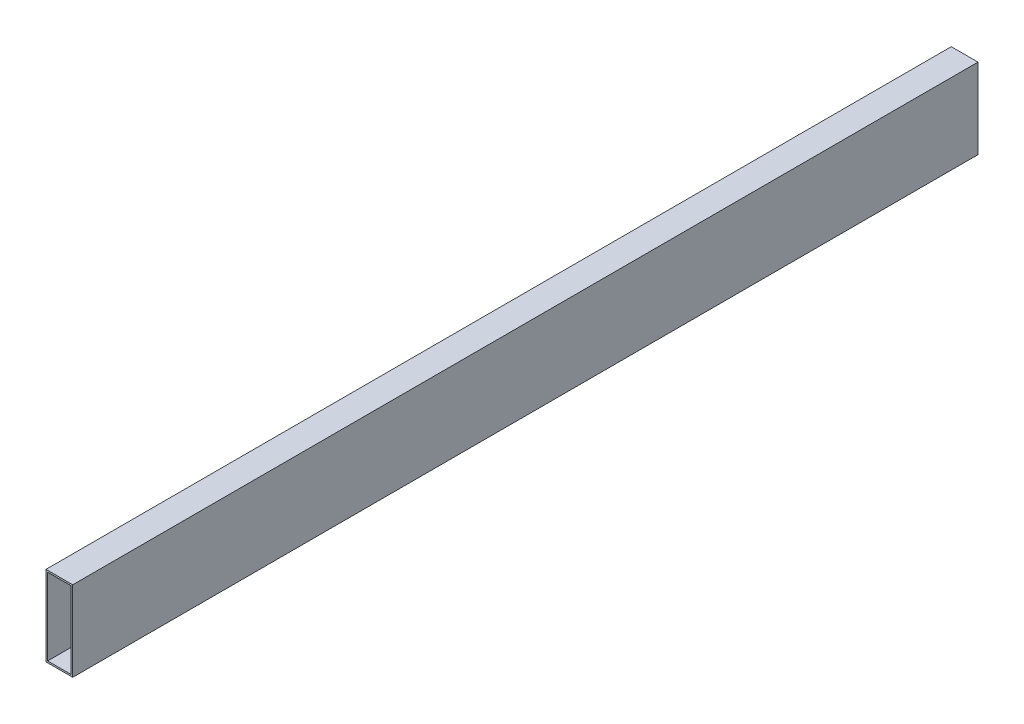
ISO-10303-21;
HEADER;
FILE_DESCRIPTION(('STEP AP214'),'2;1');
FILE_NAME('part.step','',(''),(''),'','','');
FILE_SCHEMA(('AUTOMOTIVE_DESIGN { 1 0 10303 214 1 1 1 1 }'));
ENDSEC;
DATA;
#1=APPLICATION_CONTEXT('core data for automotive mechanical design processes');
#2=APPLICATION_PROTOCOL_DEFINITION('international standard','automotive_design',2000,#1);
#3=PRODUCT_CONTEXT('',#1,'mechanical');
#4=PRODUCT('Part','Part','',(#3));
#5=PRODUCT_RELATED_PRODUCT_CATEGORY('part','',(#4));
#6=PRODUCT_DEFINITION_FORMATION('','',#4);
#7=PRODUCT_DEFINITION_CONTEXT('part definition',#1,'design');
#8=PRODUCT_DEFINITION('design','',#6,#7);
#9=PRODUCT_DEFINITION_SHAPE('','',#8);
#10=(LENGTH_UNIT() NAMED_UNIT(*) SI_UNIT(.MILLI.,.METRE.));
#11=(NAMED_UNIT(*) PLANE_ANGLE_UNIT() SI_UNIT($,.RADIAN.));
#12=(NAMED_UNIT(*) SI_UNIT($,.STERADIAN.) SOLID_ANGLE_UNIT());
#13=UNCERTAINTY_MEASURE_WITH_UNIT(LENGTH_MEASURE(1.E-05),#10,'distance_accuracy_value','');
#14=(GEOMETRIC_REPRESENTATION_CONTEXT(3) GLOBAL_UNCERTAINTY_ASSIGNED_CONTEXT((#13)) GLOBAL_UNIT_ASSIGNED_CONTEXT((#10,
#11,#12)) REPRESENTATION_CONTEXT('',''));
#15=CARTESIAN_POINT('',(0.,0.,0.));
#16=DIRECTION('',(0.,0.,1.));
#17=DIRECTION('',(1.,0.,0.));
#18=AXIS2_PLACEMENT_3D('',#15,#16,#17);
#19=CARTESIAN_POINT('',(0.,152.4,1720.85));
#20=DIRECTION('',(0.,0.,-1.));
#21=DIRECTION('',(-1.,0.,0.));
#22=AXIS2_PLACEMENT_3D('',#19,#20,#21);
#23=PLANE('',#22);
#24=DIRECTION('',(0.,-1.,0.));
#25=VECTOR('',#24,1.);
#26=CARTESIAN_POINT('',(0.,0.,1720.85));
#27=LINE('',#26,#25);
#28=CARTESIAN_POINT('',(0.,152.4,1720.85));
#29=VERTEX_POINT('',#28);
#30=CARTESIAN_POINT('',(0.,0.,1720.85));
#31=VERTEX_POINT('',#30);
#32=EDGE_CURVE('E130',#29,#31,#27,.T.);
#33=ORIENTED_EDGE('',*,*,#32,.T.);
#34=DIRECTION('',(1.,0.,0.));
#35=VECTOR('',#34,1.);
#36=CARTESIAN_POINT('',(0.,0.,1720.85));
#37=LINE('',#36,#35);
#38=CARTESIAN_POINT('',(50.8,0.,1720.85));
#39=VERTEX_POINT('',#38);
#40=EDGE_CURVE('E133',#31,#39,#37,.T.);
#41=ORIENTED_EDGE('',*,*,#40,.T.);
#42=DIRECTION('',(0.,1.,0.));
#43=VECTOR('',#42,1.);
#44=CARTESIAN_POINT('',(50.8,0.,1720.85));
#45=LINE('',#44,#43);
#46=CARTESIAN_POINT('',(50.8,152.4,1720.85));
#47=VERTEX_POINT('',#46);
#48=EDGE_CURVE('E136',#39,#47,#45,.T.);
#49=ORIENTED_EDGE('',*,*,#48,.T.);
#50=DIRECTION('',(-1.,0.,0.));
#51=VECTOR('',#50,1.);
#52=CARTESIAN_POINT('',(0.,152.4,1720.85));
#53=LINE('',#52,#51);
#54=EDGE_CURVE('E138',#47,#29,#53,.T.);
#55=ORIENTED_EDGE('',*,*,#54,.T.);
#56=EDGE_LOOP('',(#33,#41,#49,#55));
#57=FACE_BOUND('',#56,.T.);
#58=DIRECTION('',(0.,-1.,0.));
#59=VECTOR('',#58,1.);
#60=CARTESIAN_POINT('',(3.17499999999996,152.4,1720.85));
#61=LINE('',#60,#59);
#62=CARTESIAN_POINT('',(3.17499999999996,149.225,1720.85));
#63=VERTEX_POINT('',#62);
#64=CARTESIAN_POINT('',(3.175,3.175,1720.85));
#65=VERTEX_POINT('',#64);
#66=EDGE_CURVE('E118',#63,#65,#61,.T.);
#67=ORIENTED_EDGE('',*,*,#66,.F.);
#68=DIRECTION('',(-1.,0.,0.));
#69=VECTOR('',#68,1.);
#70=CARTESIAN_POINT('',(0.,149.225,1720.85));
#71=LINE('',#70,#69);
#72=CARTESIAN_POINT('',(47.625,149.225,1720.85));
#73=VERTEX_POINT('',#72);
#74=EDGE_CURVE('E103',#73,#63,#71,.T.);
#75=ORIENTED_EDGE('',*,*,#74,.F.);
#76=DIRECTION('',(0.,1.,0.));
#77=VECTOR('',#76,1.);
#78=CARTESIAN_POINT('',(47.625,152.4,1720.85));
#79=LINE('',#78,#77);
#80=CARTESIAN_POINT('',(47.625,3.175,1720.85));
#81=VERTEX_POINT('',#80);
#82=EDGE_CURVE('E127',#81,#73,#79,.T.);
#83=ORIENTED_EDGE('',*,*,#82,.F.);
#84=DIRECTION('',(1.,0.,0.));
#85=VECTOR('',#84,1.);
#86=CARTESIAN_POINT('',(0.,3.17500000000001,1720.85));
#87=LINE('',#86,#85);
#88=EDGE_CURVE('E120',#65,#81,#87,.T.);
#89=ORIENTED_EDGE('',*,*,#88,.F.);
#90=EDGE_LOOP('',(#67,#75,#83,#89));
#91=FACE_BOUND('',#90,.T.);
#92=ADVANCED_FACE('F33',(#57,#91),#23,.F.);
#93=CARTESIAN_POINT('',(0.,152.4,0.));
#94=DIRECTION('',(0.,0.,-1.));
#95=DIRECTION('',(-1.,0.,0.));
#96=AXIS2_PLACEMENT_3D('',#93,#94,#95);
#97=PLANE('',#96);
#98=DIRECTION('',(0.,-1.,0.));
#99=VECTOR('',#98,1.);
#100=CARTESIAN_POINT('',(0.,0.,0.));
#101=LINE('',#100,#99);
#102=CARTESIAN_POINT('',(0.,152.4,0.));
#103=VERTEX_POINT('',#102);
#104=CARTESIAN_POINT('',(0.,0.,0.));
#105=VERTEX_POINT('',#104);
#106=EDGE_CURVE('E141',#103,#105,#101,.T.);
#107=ORIENTED_EDGE('',*,*,#106,.F.);
#108=DIRECTION('',(-1.,0.,0.));
#109=VECTOR('',#108,1.);
#110=CARTESIAN_POINT('',(0.,152.4,0.));
#111=LINE('',#110,#109);
#112=CARTESIAN_POINT('',(50.8,152.4,0.));
#113=VERTEX_POINT('',#112);
#114=EDGE_CURVE('E134',#113,#103,#111,.T.);
#115=ORIENTED_EDGE('',*,*,#114,.F.);
#116=DIRECTION('',(0.,1.,0.));
#117=VECTOR('',#116,1.);
#118=CARTESIAN_POINT('',(50.8,0.,0.));
#119=LINE('',#118,#117);
#120=CARTESIAN_POINT('',(50.8,0.,0.));
#121=VERTEX_POINT('',#120);
#122=EDGE_CURVE('E146',#121,#113,#119,.T.);
#123=ORIENTED_EDGE('',*,*,#122,.F.);
#124=DIRECTION('',(1.,0.,0.));
#125=VECTOR('',#124,1.);
#126=CARTESIAN_POINT('',(0.,0.,0.));
#127=LINE('',#126,#125);
#128=EDGE_CURVE('E144',#105,#121,#127,.T.);
#129=ORIENTED_EDGE('',*,*,#128,.F.);
#130=EDGE_LOOP('',(#107,#115,#123,#129));
#131=FACE_BOUND('',#130,.T.);
#132=DIRECTION('',(-1.,0.,0.));
#133=VECTOR('',#132,1.);
#134=CARTESIAN_POINT('',(0.,149.225,0.));
#135=LINE('',#134,#133);
#136=CARTESIAN_POINT('',(47.625,149.225,0.));
#137=VERTEX_POINT('',#136);
#138=CARTESIAN_POINT('',(3.17499999999996,149.225,0.));
#139=VERTEX_POINT('',#138);
#140=EDGE_CURVE('E101',#137,#139,#135,.T.);
#141=ORIENTED_EDGE('',*,*,#140,.T.);
#142=DIRECTION('',(0.,-1.,0.));
#143=VECTOR('',#142,1.);
#144=CARTESIAN_POINT('',(3.17499999999996,152.4,0.));
#145=LINE('',#144,#143);
#146=CARTESIAN_POINT('',(3.175,3.175,0.));
#147=VERTEX_POINT('',#146);
#148=EDGE_CURVE('E109',#139,#147,#145,.T.);
#149=ORIENTED_EDGE('',*,*,#148,.T.);
#150=DIRECTION('',(1.,0.,0.));
#151=VECTOR('',#150,1.);
#152=CARTESIAN_POINT('',(0.,3.17500000000001,0.));
#153=LINE('',#152,#151);
#154=CARTESIAN_POINT('',(47.625,3.175,0.));
#155=VERTEX_POINT('',#154);
#156=EDGE_CURVE('E115',#147,#155,#153,.T.);
#157=ORIENTED_EDGE('',*,*,#156,.T.);
#158=DIRECTION('',(0.,1.,0.));
#159=VECTOR('',#158,1.);
#160=CARTESIAN_POINT('',(47.625,152.4,0.));
#161=LINE('',#160,#159);
#162=EDGE_CURVE('E55',#155,#137,#161,.T.);
#163=ORIENTED_EDGE('',*,*,#162,.T.);
#164=EDGE_LOOP('',(#141,#149,#157,#163));
#165=FACE_BOUND('',#164,.T.);
#166=ADVANCED_FACE('F117',(#131,#165),#97,.T.);
#167=CARTESIAN_POINT('',(0.,0.,1720.85));
#168=DIRECTION('',(1.,0.,0.));
#169=DIRECTION('',(0.,1.,0.));
#170=AXIS2_PLACEMENT_3D('',#167,#168,#169);
#171=PLANE('',#170);
#172=ORIENTED_EDGE('',*,*,#106,.T.);
#173=DIRECTION('',(0.,0.,-1.));
#174=VECTOR('',#173,1.);
#175=CARTESIAN_POINT('',(0.,0.,1720.85));
#176=LINE('',#175,#174);
#177=EDGE_CURVE('E11',#31,#105,#176,.T.);
#178=ORIENTED_EDGE('',*,*,#177,.F.);
#179=ORIENTED_EDGE('',*,*,#32,.F.);
#180=DIRECTION('',(0.,0.,-1.));
#181=VECTOR('',#180,1.);
#182=CARTESIAN_POINT('',(0.,152.4,1720.85));
#183=LINE('',#182,#181);
#184=EDGE_CURVE('E140',#29,#103,#183,.T.);
#185=ORIENTED_EDGE('',*,*,#184,.T.);
#186=EDGE_LOOP('',(#172,#178,#179,#185));
#187=FACE_BOUND('',#186,.T.);
#188=ADVANCED_FACE('F35',(#187),#171,.F.);
#189=CARTESIAN_POINT('',(0.,0.,1720.85));
#190=DIRECTION('',(0.,1.,0.));
#191=DIRECTION('',(0.,0.,1.));
#192=AXIS2_PLACEMENT_3D('',#189,#190,#191);
#193=PLANE('',#192);
#194=ORIENTED_EDGE('',*,*,#128,.T.);
#195=DIRECTION('',(0.,0.,-1.));
#196=VECTOR('',#195,1.);
#197=CARTESIAN_POINT('',(50.8,0.,1720.85));
#198=LINE('',#197,#196);
#199=EDGE_CURVE('E41',#39,#121,#198,.T.);
#200=ORIENTED_EDGE('',*,*,#199,.F.);
#201=ORIENTED_EDGE('',*,*,#40,.F.);
#202=ORIENTED_EDGE('',*,*,#177,.T.);
#203=EDGE_LOOP('',(#194,#200,#201,#202));
#204=FACE_BOUND('',#203,.T.);
#205=ADVANCED_FACE('F173',(#204),#193,.F.);
#206=CARTESIAN_POINT('',(50.8,0.,1720.85));
#207=DIRECTION('',(-1.,0.,0.));
#208=DIRECTION('',(0.,0.,1.));
#209=AXIS2_PLACEMENT_3D('',#206,#207,#208);
#210=PLANE('',#209);
#211=ORIENTED_EDGE('',*,*,#122,.T.);
#212=DIRECTION('',(0.,0.,-1.));
#213=VECTOR('',#212,1.);
#214=CARTESIAN_POINT('',(50.8,152.4,1720.85));
#215=LINE('',#214,#213);
#216=EDGE_CURVE('E151',#47,#113,#215,.T.);
#217=ORIENTED_EDGE('',*,*,#216,.F.);
#218=ORIENTED_EDGE('',*,*,#48,.F.);
#219=ORIENTED_EDGE('',*,*,#199,.T.);
#220=EDGE_LOOP('',(#211,#217,#218,#219));
#221=FACE_BOUND('',#220,.T.);
#222=ADVANCED_FACE('F158',(#221),#210,.F.);
#223=CARTESIAN_POINT('',(0.,152.4,1720.85));
#224=DIRECTION('',(0.,-1.,0.));
#225=DIRECTION('',(0.,0.,-1.));
#226=AXIS2_PLACEMENT_3D('',#223,#224,#225);
#227=PLANE('',#226);
#228=ORIENTED_EDGE('',*,*,#114,.T.);
#229=ORIENTED_EDGE('',*,*,#184,.F.);
#230=ORIENTED_EDGE('',*,*,#54,.F.);
#231=ORIENTED_EDGE('',*,*,#216,.T.);
#232=EDGE_LOOP('',(#228,#229,#230,#231));
#233=FACE_BOUND('',#232,.T.);
#234=ADVANCED_FACE('F166',(#233),#227,.F.);
#235=CARTESIAN_POINT('',(3.175,0.,1720.85));
#236=DIRECTION('',(1.,0.,0.));
#237=DIRECTION('',(0.,1.,0.));
#238=AXIS2_PLACEMENT_3D('',#235,#236,#237);
#239=PLANE('',#238);
#240=ORIENTED_EDGE('',*,*,#148,.F.);
#241=DIRECTION('',(0.,0.,-1.));
#242=VECTOR('',#241,1.);
#243=CARTESIAN_POINT('',(3.17499999999996,149.225,1720.85));
#244=LINE('',#243,#242);
#245=EDGE_CURVE('E97',#63,#139,#244,.T.);
#246=ORIENTED_EDGE('',*,*,#245,.F.);
#247=ORIENTED_EDGE('',*,*,#66,.T.);
#248=DIRECTION('',(0.,0.,-1.));
#249=VECTOR('',#248,1.);
#250=CARTESIAN_POINT('',(3.175,3.175,1720.85));
#251=LINE('',#250,#249);
#252=EDGE_CURVE('E112',#65,#147,#251,.T.);
#253=ORIENTED_EDGE('',*,*,#252,.T.);
#254=EDGE_LOOP('',(#240,#246,#247,#253));
#255=FACE_BOUND('',#254,.T.);
#256=ADVANCED_FACE('F110',(#255),#239,.T.);
#257=CARTESIAN_POINT('',(0.,3.175,1720.85));
#258=DIRECTION('',(0.,1.,0.));
#259=DIRECTION('',(0.,0.,1.));
#260=AXIS2_PLACEMENT_3D('',#257,#258,#259);
#261=PLANE('',#260);
#262=ORIENTED_EDGE('',*,*,#156,.F.);
#263=ORIENTED_EDGE('',*,*,#252,.F.);
#264=ORIENTED_EDGE('',*,*,#88,.T.);
#265=DIRECTION('',(0.,0.,-1.));
#266=VECTOR('',#265,1.);
#267=CARTESIAN_POINT('',(47.625,3.175,1720.85));
#268=LINE('',#267,#266);
#269=EDGE_CURVE('E256',#81,#155,#268,.T.);
#270=ORIENTED_EDGE('',*,*,#269,.T.);
#271=EDGE_LOOP('',(#262,#263,#264,#270));
#272=FACE_BOUND('',#271,.T.);
#273=ADVANCED_FACE('F193',(#272),#261,.T.);
#274=CARTESIAN_POINT('',(47.625,0.,1720.85));
#275=DIRECTION('',(-1.,0.,0.));
#276=DIRECTION('',(0.,0.,1.));
#277=AXIS2_PLACEMENT_3D('',#274,#275,#276);
#278=PLANE('',#277);
#279=ORIENTED_EDGE('',*,*,#162,.F.);
#280=ORIENTED_EDGE('',*,*,#269,.F.);
#281=ORIENTED_EDGE('',*,*,#82,.T.);
#282=DIRECTION('',(0.,0.,-1.));
#283=VECTOR('',#282,1.);
#284=CARTESIAN_POINT('',(47.625,149.225,1720.85));
#285=LINE('',#284,#283);
#286=EDGE_CURVE('E48',#73,#137,#285,.T.);
#287=ORIENTED_EDGE('',*,*,#286,.T.);
#288=EDGE_LOOP('',(#279,#280,#281,#287));
#289=FACE_BOUND('',#288,.T.);
#290=ADVANCED_FACE('F198',(#289),#278,.T.);
#291=CARTESIAN_POINT('',(0.,149.225,1720.85));
#292=DIRECTION('',(0.,-1.,0.));
#293=DIRECTION('',(0.,0.,-1.));
#294=AXIS2_PLACEMENT_3D('',#291,#292,#293);
#295=PLANE('',#294);
#296=ORIENTED_EDGE('',*,*,#140,.F.);
#297=ORIENTED_EDGE('',*,*,#286,.F.);
#298=ORIENTED_EDGE('',*,*,#74,.T.);
#299=ORIENTED_EDGE('',*,*,#245,.T.);
#300=EDGE_LOOP('',(#296,#297,#298,#299));
#301=FACE_BOUND('',#300,.T.);
#302=ADVANCED_FACE('F99',(#301),#295,.T.);
#303=CLOSED_SHELL('',(#92,#166,#188,#205,#222,#234,#256,#273,#290,#302));
#304=MANIFOLD_SOLID_BREP('B2',#303);
#305=ADVANCED_BREP_SHAPE_REPRESENTATION('',(#18,#304),#14);
#306=SHAPE_DEFINITION_REPRESENTATION(#9,#305);
ENDSEC;
END-ISO-10303-21;
